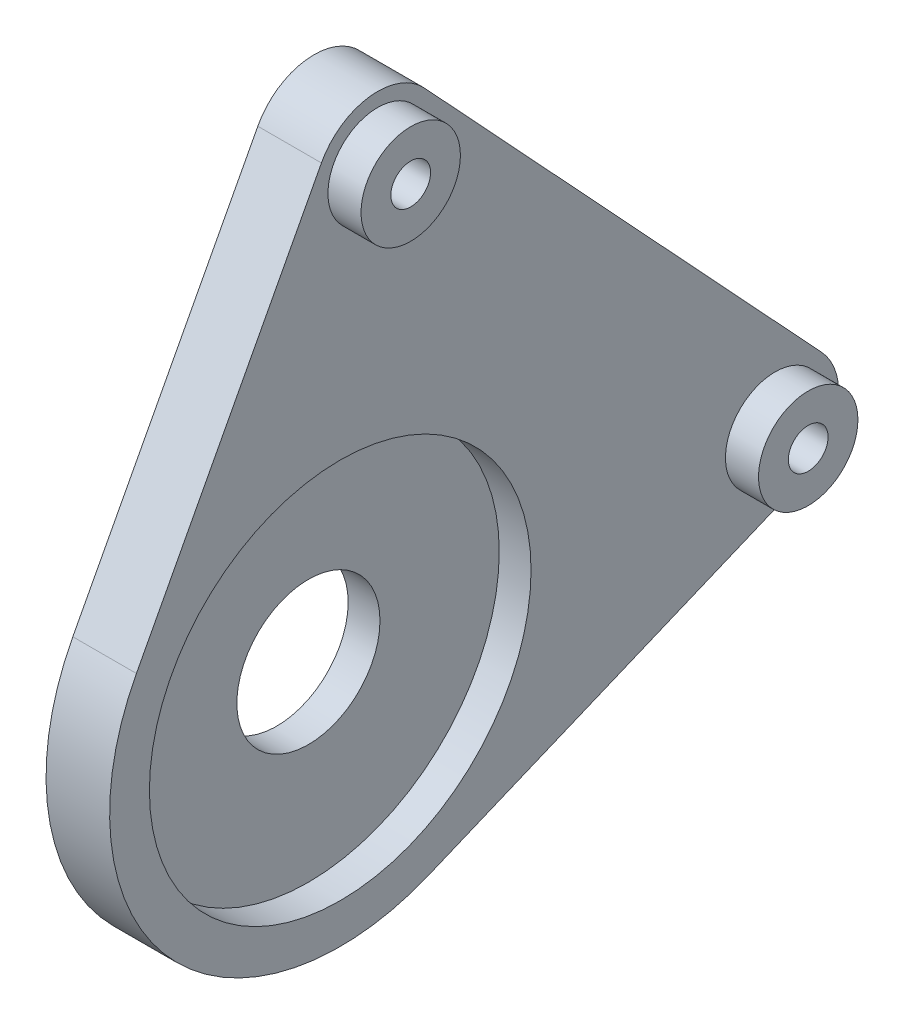
ISO-10303-21;
HEADER;
FILE_DESCRIPTION(('STEP AP214'),'2;1');
FILE_NAME('part.step','',(''),(''),'','','');
FILE_SCHEMA(('AUTOMOTIVE_DESIGN { 1 0 10303 214 1 1 1 1 }'));
ENDSEC;
DATA;
#1=APPLICATION_CONTEXT('core data for automotive mechanical design processes');
#2=APPLICATION_PROTOCOL_DEFINITION('international standard','automotive_design',2000,#1);
#3=PRODUCT_CONTEXT('',#1,'mechanical');
#4=PRODUCT('Part','Part','',(#3));
#5=PRODUCT_RELATED_PRODUCT_CATEGORY('part','',(#4));
#6=PRODUCT_DEFINITION_FORMATION('','',#4);
#7=PRODUCT_DEFINITION_CONTEXT('part definition',#1,'design');
#8=PRODUCT_DEFINITION('design','',#6,#7);
#9=PRODUCT_DEFINITION_SHAPE('','',#8);
#10=(LENGTH_UNIT() NAMED_UNIT(*) SI_UNIT(.MILLI.,.METRE.));
#11=(NAMED_UNIT(*) PLANE_ANGLE_UNIT() SI_UNIT($,.RADIAN.));
#12=(NAMED_UNIT(*) SI_UNIT($,.STERADIAN.) SOLID_ANGLE_UNIT());
#13=UNCERTAINTY_MEASURE_WITH_UNIT(LENGTH_MEASURE(1.E-05),#10,'distance_accuracy_value','');
#14=(GEOMETRIC_REPRESENTATION_CONTEXT(3) GLOBAL_UNCERTAINTY_ASSIGNED_CONTEXT((#13)) GLOBAL_UNIT_ASSIGNED_CONTEXT((#10,
#11,#12)) REPRESENTATION_CONTEXT('',''));
#15=CARTESIAN_POINT('',(0.,0.,0.));
#16=DIRECTION('',(0.,0.,1.));
#17=DIRECTION('',(1.,0.,0.));
#18=AXIS2_PLACEMENT_3D('',#15,#16,#17);
#19=CARTESIAN_POINT('',(4.,0.,0.));
#20=DIRECTION('',(-1.,0.,0.));
#21=DIRECTION('',(0.,0.,1.));
#22=AXIS2_PLACEMENT_3D('',#19,#20,#21);
#23=CYLINDRICAL_SURFACE('',#22,14.5);
#24=CARTESIAN_POINT('',(0.,0.,0.));
#25=DIRECTION('',(1.,0.,0.));
#26=DIRECTION('',(0.,0.,-1.));
#27=AXIS2_PLACEMENT_3D('',#24,#25,#26);
#28=CIRCLE('',#27,14.5);
#29=CARTESIAN_POINT('',(0.,6.78171232723155,12.816332467234));
#30=VERTEX_POINT('',#29);
#31=CARTESIAN_POINT('',(0.,-13.388858942061,-5.56672760511883));
#32=VERTEX_POINT('',#31);
#33=EDGE_CURVE('E120',#30,#32,#28,.T.);
#34=ORIENTED_EDGE('',*,*,#33,.T.);
#35=DIRECTION('',(-1.,0.,0.));
#36=VECTOR('',#35,1.);
#37=CARTESIAN_POINT('',(4.,-13.388858942061,-5.56672760511883));
#38=LINE('',#37,#36);
#39=CARTESIAN_POINT('',(4.,-13.388858942061,-5.56672760511883));
#40=VERTEX_POINT('',#39);
#41=EDGE_CURVE('E43',#40,#32,#38,.T.);
#42=ORIENTED_EDGE('',*,*,#41,.F.);
#43=CARTESIAN_POINT('',(4.,0.,0.));
#44=DIRECTION('',(1.,0.,0.));
#45=DIRECTION('',(0.,0.,-1.));
#46=AXIS2_PLACEMENT_3D('',#43,#44,#45);
#47=CIRCLE('',#46,14.5);
#48=CARTESIAN_POINT('',(4.,6.78171232723155,12.816332467234));
#49=VERTEX_POINT('',#48);
#50=EDGE_CURVE('E85',#49,#40,#47,.T.);
#51=ORIENTED_EDGE('',*,*,#50,.F.);
#52=DIRECTION('',(-1.,0.,0.));
#53=VECTOR('',#52,1.);
#54=CARTESIAN_POINT('',(4.,6.78171232723155,12.816332467234));
#55=LINE('',#54,#53);
#56=EDGE_CURVE('E119',#49,#30,#55,.T.);
#57=ORIENTED_EDGE('',*,*,#56,.T.);
#58=EDGE_LOOP('',(#34,#42,#51,#57));
#59=FACE_BOUND('',#58,.T.);
#60=ADVANCED_FACE('F34',(#59),#23,.T.);
#61=CARTESIAN_POINT('',(4.,-13.388858942061,-5.56672760511883));
#62=DIRECTION('',(0.,-0.923369582211106,-0.383912248628885));
#63=DIRECTION('',(0.,0.383912248628885,-0.923369582211107));
#64=AXIS2_PLACEMENT_3D('',#61,#62,#63);
#65=PLANE('',#64);
#66=DIRECTION('',(0.,-0.383912248628885,0.923369582211107));
#67=VECTOR('',#66,1.);
#68=CARTESIAN_POINT('',(0.,-13.388858942061,-5.56672760511883));
#69=LINE('',#68,#67);
#70=CARTESIAN_POINT('',(0.,-3.69347832884442,-28.8856489945155));
#71=VERTEX_POINT('',#70);
#72=EDGE_CURVE('E123',#71,#32,#69,.T.);
#73=ORIENTED_EDGE('',*,*,#72,.F.);
#74=DIRECTION('',(-1.,0.,0.));
#75=VECTOR('',#74,1.);
#76=CARTESIAN_POINT('',(4.,-3.69347832884442,-28.8856489945155));
#77=LINE('',#76,#75);
#78=CARTESIAN_POINT('',(4.,-3.69347832884442,-28.8856489945155));
#79=VERTEX_POINT('',#78);
#80=EDGE_CURVE('E143',#79,#71,#77,.T.);
#81=ORIENTED_EDGE('',*,*,#80,.F.);
#82=DIRECTION('',(0.,-0.383912248628885,0.923369582211107));
#83=VECTOR('',#82,1.);
#84=CARTESIAN_POINT('',(4.,-13.388858942061,-5.56672760511883));
#85=LINE('',#84,#83);
#86=EDGE_CURVE('E114',#79,#40,#85,.T.);
#87=ORIENTED_EDGE('',*,*,#86,.T.);
#88=ORIENTED_EDGE('',*,*,#41,.T.);
#89=EDGE_LOOP('',(#73,#81,#87,#88));
#90=FACE_BOUND('',#89,.T.);
#91=ADVANCED_FACE('F147',(#90),#65,.T.);
#92=CARTESIAN_POINT('',(4.,0.,-27.35));
#93=DIRECTION('',(-1.,0.,0.));
#94=DIRECTION('',(0.,0.,1.));
#95=AXIS2_PLACEMENT_3D('',#92,#93,#94);
#96=CYLINDRICAL_SURFACE('',#95,4.);
#97=CARTESIAN_POINT('',(0.,0.,-27.35));
#98=DIRECTION('',(1.,0.,0.));
#99=DIRECTION('',(0.,0.,-1.));
#100=AXIS2_PLACEMENT_3D('',#97,#98,#99);
#101=CIRCLE('',#100,4.);
#102=CARTESIAN_POINT('',(0.,2.72301917775991,-30.2800454872837));
#103=VERTEX_POINT('',#102);
#104=EDGE_CURVE('E127',#71,#103,#101,.T.);
#105=ORIENTED_EDGE('',*,*,#104,.T.);
#106=DIRECTION('',(-1.,0.,0.));
#107=VECTOR('',#106,1.);
#108=CARTESIAN_POINT('',(4.,2.72301917775991,-30.2800454872837));
#109=LINE('',#108,#107);
#110=CARTESIAN_POINT('',(4.,2.72301917775991,-30.2800454872837));
#111=VERTEX_POINT('',#110);
#112=EDGE_CURVE('E103',#111,#103,#109,.T.);
#113=ORIENTED_EDGE('',*,*,#112,.F.);
#114=CARTESIAN_POINT('',(4.,0.,-27.35));
#115=DIRECTION('',(1.,0.,0.));
#116=DIRECTION('',(0.,0.,-1.));
#117=AXIS2_PLACEMENT_3D('',#114,#115,#116);
#118=CIRCLE('',#117,4.);
#119=EDGE_CURVE('E111',#79,#111,#118,.T.);
#120=ORIENTED_EDGE('',*,*,#119,.F.);
#121=ORIENTED_EDGE('',*,*,#80,.T.);
#122=EDGE_LOOP('',(#105,#113,#120,#121));
#123=FACE_BOUND('',#122,.T.);
#124=ADVANCED_FACE('F155',(#123),#96,.T.);
#125=CARTESIAN_POINT('',(4.,16.3613873631025,-17.6053145715987));
#126=DIRECTION('',(0.,0.680754794439978,-0.732511371820932));
#127=DIRECTION('',(0.,0.732511371820932,0.680754794439978));
#128=AXIS2_PLACEMENT_3D('',#125,#126,#127);
#129=PLANE('',#128);
#130=DIRECTION('',(0.,-0.732511371820932,-0.680754794439978));
#131=VECTOR('',#130,1.);
#132=CARTESIAN_POINT('',(0.,16.3613873631025,-17.6053145715987));
#133=LINE('',#132,#131);
#134=CARTESIAN_POINT('',(0.,29.6202760262371,-5.28325054147031));
#135=VERTEX_POINT('',#134);
#136=EDGE_CURVE('E102',#135,#103,#133,.T.);
#137=ORIENTED_EDGE('',*,*,#136,.F.);
#138=DIRECTION('',(-1.,0.,0.));
#139=VECTOR('',#138,1.);
#140=CARTESIAN_POINT('',(4.,29.6202760262371,-5.28325054147031));
#141=LINE('',#140,#139);
#142=CARTESIAN_POINT('',(4.,29.6202760262371,-5.28325054147031));
#143=VERTEX_POINT('',#142);
#144=EDGE_CURVE('E96',#143,#135,#141,.T.);
#145=ORIENTED_EDGE('',*,*,#144,.F.);
#146=DIRECTION('',(0.,-0.732511371820932,-0.680754794439978));
#147=VECTOR('',#146,1.);
#148=CARTESIAN_POINT('',(4.,16.3613873631025,-17.6053145715987));
#149=LINE('',#148,#147);
#150=EDGE_CURVE('E100',#143,#111,#149,.T.);
#151=ORIENTED_EDGE('',*,*,#150,.T.);
#152=ORIENTED_EDGE('',*,*,#112,.T.);
#153=EDGE_LOOP('',(#137,#145,#151,#152));
#154=FACE_BOUND('',#153,.T.);
#155=ADVANCED_FACE('F98',(#154),#129,.T.);
#156=CARTESIAN_POINT('',(4.,26.8972568484771,-2.35320505418658));
#157=DIRECTION('',(-1.,0.,0.));
#158=DIRECTION('',(0.,0.,1.));
#159=AXIS2_PLACEMENT_3D('',#156,#157,#158);
#160=CYLINDRICAL_SURFACE('',#159,4.);
#161=CARTESIAN_POINT('',(0.,26.8972568484771,-2.35320505418658));
#162=DIRECTION('',(1.,0.,0.));
#163=DIRECTION('',(0.,0.,-1.));
#164=AXIS2_PLACEMENT_3D('',#161,#162,#163);
#165=CIRCLE('',#164,4.);
#166=CARTESIAN_POINT('',(0.,28.7680740421962,1.18233493677451));
#167=VERTEX_POINT('',#166);
#168=EDGE_CURVE('E73',#135,#167,#165,.T.);
#169=ORIENTED_EDGE('',*,*,#168,.T.);
#170=DIRECTION('',(-1.,0.,0.));
#171=VECTOR('',#170,1.);
#172=CARTESIAN_POINT('',(4.,28.7680740421962,1.18233493677451));
#173=LINE('',#172,#171);
#174=CARTESIAN_POINT('',(4.,28.7680740421962,1.18233493677451));
#175=VERTEX_POINT('',#174);
#176=EDGE_CURVE('E104',#175,#167,#173,.T.);
#177=ORIENTED_EDGE('',*,*,#176,.F.);
#178=CARTESIAN_POINT('',(4.,26.8972568484771,-2.35320505418658));
#179=DIRECTION('',(1.,0.,0.));
#180=DIRECTION('',(0.,0.,-1.));
#181=AXIS2_PLACEMENT_3D('',#178,#179,#180);
#182=CIRCLE('',#181,4.);
#183=EDGE_CURVE('E106',#143,#175,#182,.T.);
#184=ORIENTED_EDGE('',*,*,#183,.F.);
#185=ORIENTED_EDGE('',*,*,#144,.T.);
#186=EDGE_LOOP('',(#169,#177,#184,#185));
#187=FACE_BOUND('',#186,.T.);
#188=ADVANCED_FACE('F107',(#187),#160,.T.);
#189=CARTESIAN_POINT('',(4.,26.8972568484771,-2.35320505418658));
#190=DIRECTION('',(-1.,0.,0.));
#191=DIRECTION('',(0.,0.,1.));
#192=AXIS2_PLACEMENT_3D('',#189,#190,#191);
#193=CYLINDRICAL_SURFACE('',#192,1.25);
#194=CARTESIAN_POINT('',(0.,26.8972568484771,-2.35320505418658));
#195=DIRECTION('',(1.,0.,0.));
#196=DIRECTION('',(0.,0.,-1.));
#197=AXIS2_PLACEMENT_3D('',#194,#195,#196);
#198=CIRCLE('',#197,1.25);
#199=CARTESIAN_POINT('',(0.,26.8972568484771,-3.60320505418659));
#200=VERTEX_POINT('',#199);
#201=EDGE_CURVE('E133',#200,#200,#198,.T.);
#202=ORIENTED_EDGE('',*,*,#201,.F.);
#203=EDGE_LOOP('',(#202));
#204=FACE_BOUND('',#203,.T.);
#205=CARTESIAN_POINT('',(6.08,26.8972568484771,-2.35320505418658));
#206=DIRECTION('',(1.,0.,0.));
#207=DIRECTION('',(0.,0.,-1.));
#208=AXIS2_PLACEMENT_3D('',#205,#206,#207);
#209=CIRCLE('',#208,1.25);
#210=CARTESIAN_POINT('',(6.08,26.8972568484771,-3.60320505418659));
#211=VERTEX_POINT('',#210);
#212=EDGE_CURVE('E165',#211,#211,#209,.T.);
#213=ORIENTED_EDGE('',*,*,#212,.T.);
#214=EDGE_LOOP('',(#213));
#215=FACE_BOUND('',#214,.T.);
#216=ADVANCED_FACE('F224',(#204,#215),#193,.F.);
#217=CARTESIAN_POINT('',(4.,6.78171232723155,12.816332467234));
#218=DIRECTION('',(0.,-0.467704298429762,-0.883884997740274));
#219=DIRECTION('',(0.,0.883884997740274,-0.467704298429762));
#220=AXIS2_PLACEMENT_3D('',#217,#218,#219);
#221=PLANE('',#220);
#222=DIRECTION('',(0.,-0.883884997740274,0.467704298429762));
#223=VECTOR('',#222,1.);
#224=CARTESIAN_POINT('',(0.,6.78171232723155,12.816332467234));
#225=LINE('',#224,#223);
#226=EDGE_CURVE('E79',#167,#30,#225,.T.);
#227=ORIENTED_EDGE('',*,*,#226,.T.);
#228=ORIENTED_EDGE('',*,*,#56,.F.);
#229=DIRECTION('',(0.,-0.883884997740274,0.467704298429762));
#230=VECTOR('',#229,1.);
#231=CARTESIAN_POINT('',(4.,6.78171232723155,12.816332467234));
#232=LINE('',#231,#230);
#233=EDGE_CURVE('E51',#175,#49,#232,.T.);
#234=ORIENTED_EDGE('',*,*,#233,.F.);
#235=ORIENTED_EDGE('',*,*,#176,.T.);
#236=EDGE_LOOP('',(#227,#228,#234,#235));
#237=FACE_BOUND('',#236,.T.);
#238=ADVANCED_FACE('F196',(#237),#221,.F.);
#239=CARTESIAN_POINT('',(4.,0.,0.));
#240=DIRECTION('',(-1.,0.,0.));
#241=DIRECTION('',(0.,0.,1.));
#242=AXIS2_PLACEMENT_3D('',#239,#240,#241);
#243=CYLINDRICAL_SURFACE('',#242,12.);
#244=CARTESIAN_POINT('',(2.,0.,0.));
#245=DIRECTION('',(1.,0.,0.));
#246=DIRECTION('',(0.,0.,-1.));
#247=AXIS2_PLACEMENT_3D('',#244,#245,#246);
#248=CIRCLE('',#247,12.);
#249=CARTESIAN_POINT('',(2.,0.,-12.));
#250=VERTEX_POINT('',#249);
#251=EDGE_CURVE('E11',#250,#250,#248,.T.);
#252=ORIENTED_EDGE('',*,*,#251,.F.);
#253=EDGE_LOOP('',(#252));
#254=FACE_BOUND('',#253,.T.);
#255=CARTESIAN_POINT('',(4.,0.,0.));
#256=DIRECTION('',(1.,0.,0.));
#257=DIRECTION('',(0.,0.,-1.));
#258=AXIS2_PLACEMENT_3D('',#255,#256,#257);
#259=CIRCLE('',#258,12.);
#260=CARTESIAN_POINT('',(4.,0.,-12.));
#261=VERTEX_POINT('',#260);
#262=EDGE_CURVE('E139',#261,#261,#259,.T.);
#263=ORIENTED_EDGE('',*,*,#262,.T.);
#264=EDGE_LOOP('',(#263));
#265=FACE_BOUND('',#264,.T.);
#266=ADVANCED_FACE('F36',(#254,#265),#243,.F.);
#267=CARTESIAN_POINT('',(4.,0.,-27.35));
#268=DIRECTION('',(-1.,0.,0.));
#269=DIRECTION('',(0.,0.,1.));
#270=AXIS2_PLACEMENT_3D('',#267,#268,#269);
#271=CYLINDRICAL_SURFACE('',#270,1.25);
#272=CARTESIAN_POINT('',(0.,0.,-27.35));
#273=DIRECTION('',(1.,0.,0.));
#274=DIRECTION('',(0.,0.,-1.));
#275=AXIS2_PLACEMENT_3D('',#272,#273,#274);
#276=CIRCLE('',#275,1.25);
#277=CARTESIAN_POINT('',(0.,0.,-28.6));
#278=VERTEX_POINT('',#277);
#279=EDGE_CURVE('E136',#278,#278,#276,.T.);
#280=ORIENTED_EDGE('',*,*,#279,.F.);
#281=EDGE_LOOP('',(#280));
#282=FACE_BOUND('',#281,.T.);
#283=CARTESIAN_POINT('',(6.08,0.,-27.35));
#284=DIRECTION('',(1.,0.,0.));
#285=DIRECTION('',(0.,0.,-1.));
#286=AXIS2_PLACEMENT_3D('',#283,#284,#285);
#287=CIRCLE('',#286,1.25);
#288=CARTESIAN_POINT('',(6.08,0.,-28.6));
#289=VERTEX_POINT('',#288);
#290=EDGE_CURVE('E174',#289,#289,#287,.T.);
#291=ORIENTED_EDGE('',*,*,#290,.T.);
#292=EDGE_LOOP('',(#291));
#293=FACE_BOUND('',#292,.T.);
#294=ADVANCED_FACE('F195',(#282,#293),#271,.F.);
#295=CARTESIAN_POINT('',(4.,0.,0.));
#296=DIRECTION('',(1.,0.,0.));
#297=DIRECTION('',(0.,0.,-1.));
#298=AXIS2_PLACEMENT_3D('',#295,#296,#297);
#299=PLANE('',#298);
#300=CARTESIAN_POINT('',(4.,0.,-27.35));
#301=DIRECTION('',(1.,0.,0.));
#302=DIRECTION('',(0.,0.,-1.));
#303=AXIS2_PLACEMENT_3D('',#300,#301,#302);
#304=CIRCLE('',#303,3.125);
#305=CARTESIAN_POINT('',(4.,0.,-30.475));
#306=VERTEX_POINT('',#305);
#307=EDGE_CURVE('E168',#306,#306,#304,.F.);
#308=ORIENTED_EDGE('',*,*,#307,.T.);
#309=EDGE_LOOP('',(#308));
#310=FACE_BOUND('',#309,.T.);
#311=CARTESIAN_POINT('',(4.,26.8972568484771,-2.35320505418658));
#312=DIRECTION('',(1.,0.,0.));
#313=DIRECTION('',(0.,0.,-1.));
#314=AXIS2_PLACEMENT_3D('',#311,#312,#313);
#315=CIRCLE('',#314,3.125);
#316=CARTESIAN_POINT('',(4.,26.8972568484771,-5.47820505418658));
#317=VERTEX_POINT('',#316);
#318=EDGE_CURVE('E124',#317,#317,#315,.F.);
#319=ORIENTED_EDGE('',*,*,#318,.T.);
#320=EDGE_LOOP('',(#319));
#321=FACE_BOUND('',#320,.T.);
#322=ORIENTED_EDGE('',*,*,#262,.F.);
#323=EDGE_LOOP('',(#322));
#324=FACE_BOUND('',#323,.T.);
#325=ORIENTED_EDGE('',*,*,#50,.T.);
#326=ORIENTED_EDGE('',*,*,#86,.F.);
#327=ORIENTED_EDGE('',*,*,#119,.T.);
#328=ORIENTED_EDGE('',*,*,#150,.F.);
#329=ORIENTED_EDGE('',*,*,#183,.T.);
#330=ORIENTED_EDGE('',*,*,#233,.T.);
#331=EDGE_LOOP('',(#325,#326,#327,#328,#329,#330));
#332=FACE_BOUND('',#331,.T.);
#333=ADVANCED_FACE('F109',(#310,#321,#324,#332),#299,.T.);
#334=CARTESIAN_POINT('',(0.,0.,0.));
#335=DIRECTION('',(1.,0.,0.));
#336=DIRECTION('',(0.,0.,-1.));
#337=AXIS2_PLACEMENT_3D('',#334,#335,#336);
#338=PLANE('',#337);
#339=ORIENTED_EDGE('',*,*,#33,.F.);
#340=ORIENTED_EDGE('',*,*,#226,.F.);
#341=ORIENTED_EDGE('',*,*,#168,.F.);
#342=ORIENTED_EDGE('',*,*,#136,.T.);
#343=ORIENTED_EDGE('',*,*,#104,.F.);
#344=ORIENTED_EDGE('',*,*,#72,.T.);
#345=EDGE_LOOP('',(#339,#340,#341,#342,#343,#344));
#346=FACE_BOUND('',#345,.T.);
#347=ORIENTED_EDGE('',*,*,#201,.T.);
#348=EDGE_LOOP('',(#347));
#349=FACE_BOUND('',#348,.T.);
#350=ORIENTED_EDGE('',*,*,#279,.T.);
#351=EDGE_LOOP('',(#350));
#352=FACE_BOUND('',#351,.T.);
#353=CARTESIAN_POINT('',(0.,0.,0.));
#354=DIRECTION('',(1.,0.,0.));
#355=DIRECTION('',(0.,0.,-1.));
#356=AXIS2_PLACEMENT_3D('',#353,#354,#355);
#357=CIRCLE('',#356,4.5);
#358=CARTESIAN_POINT('',(0.,0.,-4.5));
#359=VERTEX_POINT('',#358);
#360=EDGE_CURVE('E178',#359,#359,#357,.T.);
#361=ORIENTED_EDGE('',*,*,#360,.T.);
#362=EDGE_LOOP('',(#361));
#363=FACE_BOUND('',#362,.T.);
#364=ADVANCED_FACE('F152',(#346,#349,#352,#363),#338,.F.);
#365=CARTESIAN_POINT('',(6.08,26.8972568484771,-2.35320505418658));
#366=DIRECTION('',(-1.,0.,0.));
#367=DIRECTION('',(0.,0.,1.));
#368=AXIS2_PLACEMENT_3D('',#365,#366,#367);
#369=CYLINDRICAL_SURFACE('',#368,3.125);
#370=ORIENTED_EDGE('',*,*,#318,.F.);
#371=EDGE_LOOP('',(#370));
#372=FACE_BOUND('',#371,.T.);
#373=CARTESIAN_POINT('',(6.08,26.8972568484771,-2.35320505418658));
#374=DIRECTION('',(1.,0.,0.));
#375=DIRECTION('',(0.,0.,-1.));
#376=AXIS2_PLACEMENT_3D('',#373,#374,#375);
#377=CIRCLE('',#376,3.125);
#378=CARTESIAN_POINT('',(6.08,26.8972568484771,-5.47820505418658));
#379=VERTEX_POINT('',#378);
#380=EDGE_CURVE('E162',#379,#379,#377,.T.);
#381=ORIENTED_EDGE('',*,*,#380,.F.);
#382=EDGE_LOOP('',(#381));
#383=FACE_BOUND('',#382,.T.);
#384=ADVANCED_FACE('F206',(#372,#383),#369,.T.);
#385=CARTESIAN_POINT('',(6.08,0.,0.));
#386=DIRECTION('',(1.,0.,0.));
#387=DIRECTION('',(0.,0.,-1.));
#388=AXIS2_PLACEMENT_3D('',#385,#386,#387);
#389=PLANE('',#388);
#390=ORIENTED_EDGE('',*,*,#212,.F.);
#391=EDGE_LOOP('',(#390));
#392=FACE_BOUND('',#391,.T.);
#393=ORIENTED_EDGE('',*,*,#380,.T.);
#394=EDGE_LOOP('',(#393));
#395=FACE_BOUND('',#394,.T.);
#396=ADVANCED_FACE('F235',(#392,#395),#389,.T.);
#397=CARTESIAN_POINT('',(6.08,0.,-27.35));
#398=DIRECTION('',(-1.,0.,0.));
#399=DIRECTION('',(0.,0.,1.));
#400=AXIS2_PLACEMENT_3D('',#397,#398,#399);
#401=CYLINDRICAL_SURFACE('',#400,3.125);
#402=ORIENTED_EDGE('',*,*,#307,.F.);
#403=EDGE_LOOP('',(#402));
#404=FACE_BOUND('',#403,.T.);
#405=CARTESIAN_POINT('',(6.08,0.,-27.35));
#406=DIRECTION('',(1.,0.,0.));
#407=DIRECTION('',(0.,0.,-1.));
#408=AXIS2_PLACEMENT_3D('',#405,#406,#407);
#409=CIRCLE('',#408,3.125);
#410=CARTESIAN_POINT('',(6.08,0.,-30.475));
#411=VERTEX_POINT('',#410);
#412=EDGE_CURVE('E171',#411,#411,#409,.T.);
#413=ORIENTED_EDGE('',*,*,#412,.F.);
#414=EDGE_LOOP('',(#413));
#415=FACE_BOUND('',#414,.T.);
#416=ADVANCED_FACE('F238',(#404,#415),#401,.T.);
#417=CARTESIAN_POINT('',(6.08,0.,0.));
#418=DIRECTION('',(1.,0.,0.));
#419=DIRECTION('',(0.,0.,-1.));
#420=AXIS2_PLACEMENT_3D('',#417,#418,#419);
#421=PLANE('',#420);
#422=ORIENTED_EDGE('',*,*,#290,.F.);
#423=EDGE_LOOP('',(#422));
#424=FACE_BOUND('',#423,.T.);
#425=ORIENTED_EDGE('',*,*,#412,.T.);
#426=EDGE_LOOP('',(#425));
#427=FACE_BOUND('',#426,.T.);
#428=ADVANCED_FACE('F250',(#424,#427),#421,.T.);
#429=CARTESIAN_POINT('',(2.,0.,0.));
#430=DIRECTION('',(-1.,0.,0.));
#431=DIRECTION('',(0.,0.,1.));
#432=AXIS2_PLACEMENT_3D('',#429,#430,#431);
#433=CYLINDRICAL_SURFACE('',#432,4.5);
#434=CARTESIAN_POINT('',(2.,0.,0.));
#435=DIRECTION('',(1.,0.,0.));
#436=DIRECTION('',(0.,0.,-1.));
#437=AXIS2_PLACEMENT_3D('',#434,#435,#436);
#438=CIRCLE('',#437,4.5);
#439=CARTESIAN_POINT('',(2.,0.,-4.5));
#440=VERTEX_POINT('',#439);
#441=EDGE_CURVE('E177',#440,#440,#438,.T.);
#442=ORIENTED_EDGE('',*,*,#441,.T.);
#443=EDGE_LOOP('',(#442));
#444=FACE_BOUND('',#443,.T.);
#445=ORIENTED_EDGE('',*,*,#360,.F.);
#446=EDGE_LOOP('',(#445));
#447=FACE_BOUND('',#446,.T.);
#448=ADVANCED_FACE('F184',(#444,#447),#433,.F.);
#449=CARTESIAN_POINT('',(2.,0.,0.));
#450=DIRECTION('',(1.,0.,0.));
#451=DIRECTION('',(0.,0.,-1.));
#452=AXIS2_PLACEMENT_3D('',#449,#450,#451);
#453=PLANE('',#452);
#454=ORIENTED_EDGE('',*,*,#441,.F.);
#455=EDGE_LOOP('',(#454));
#456=FACE_BOUND('',#455,.T.);
#457=ORIENTED_EDGE('',*,*,#251,.T.);
#458=EDGE_LOOP('',(#457));
#459=FACE_BOUND('',#458,.T.);
#460=ADVANCED_FACE('F187',(#456,#459),#453,.T.);
#461=CLOSED_SHELL('',(#60,#91,#124,#155,#188,#216,#238,#266,#294,#333,#364,#384,#396,#416,#428,
#448,#460));
#462=MANIFOLD_SOLID_BREP('B2',#461);
#463=ADVANCED_BREP_SHAPE_REPRESENTATION('',(#18,#462),#14);
#464=SHAPE_DEFINITION_REPRESENTATION(#9,#463);
ENDSEC;
END-ISO-10303-21;
